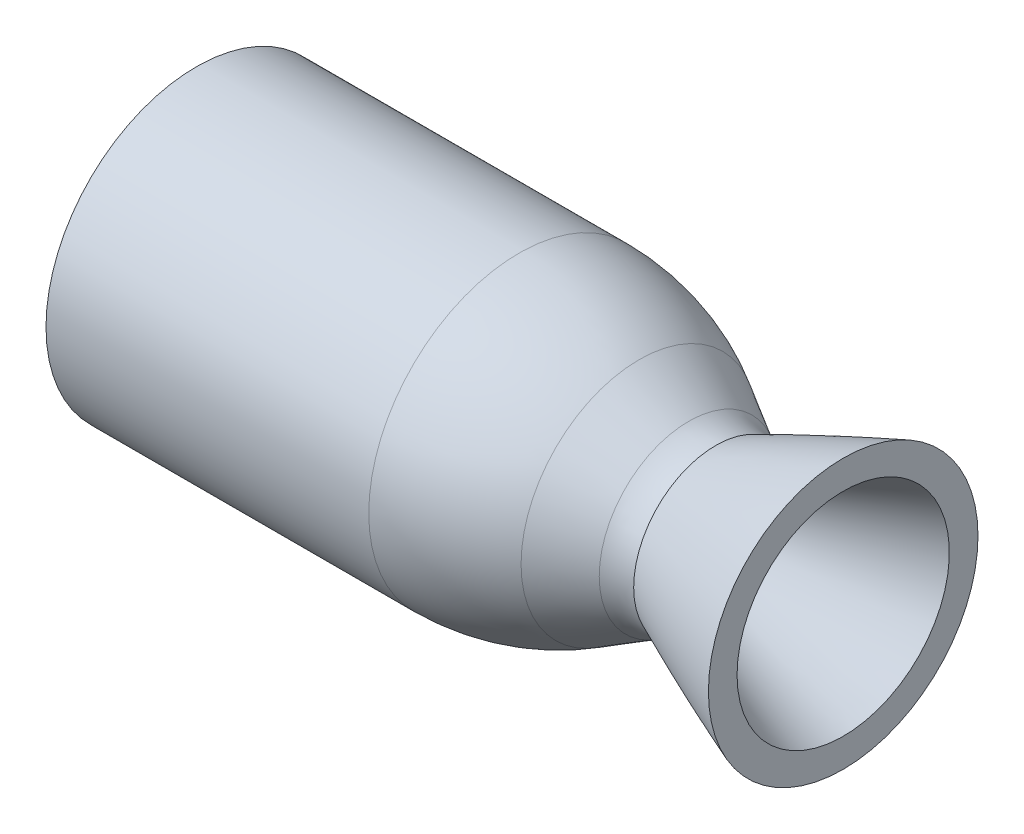
ISO-10303-21;
HEADER;
FILE_DESCRIPTION(('STEP AP214'),'2;1');
FILE_NAME('part.step','',(''),(''),'','','');
FILE_SCHEMA(('AUTOMOTIVE_DESIGN { 1 0 10303 214 1 1 1 1 }'));
ENDSEC;
DATA;
#1=APPLICATION_CONTEXT('core data for automotive mechanical design processes');
#2=APPLICATION_PROTOCOL_DEFINITION('international standard','automotive_design',2000,#1);
#3=PRODUCT_CONTEXT('',#1,'mechanical');
#4=PRODUCT('Part','Part','',(#3));
#5=PRODUCT_RELATED_PRODUCT_CATEGORY('part','',(#4));
#6=PRODUCT_DEFINITION_FORMATION('','',#4);
#7=PRODUCT_DEFINITION_CONTEXT('part definition',#1,'design');
#8=PRODUCT_DEFINITION('design','',#6,#7);
#9=PRODUCT_DEFINITION_SHAPE('','',#8);
#10=(LENGTH_UNIT() NAMED_UNIT(*) SI_UNIT(.MILLI.,.METRE.));
#11=(NAMED_UNIT(*) PLANE_ANGLE_UNIT() SI_UNIT($,.RADIAN.));
#12=(NAMED_UNIT(*) SI_UNIT($,.STERADIAN.) SOLID_ANGLE_UNIT());
#13=UNCERTAINTY_MEASURE_WITH_UNIT(LENGTH_MEASURE(1.E-05),#10,'distance_accuracy_value','');
#14=(GEOMETRIC_REPRESENTATION_CONTEXT(3) GLOBAL_UNCERTAINTY_ASSIGNED_CONTEXT((#13)) GLOBAL_UNIT_ASSIGNED_CONTEXT((#10,
#11,#12)) REPRESENTATION_CONTEXT('',''));
#15=CARTESIAN_POINT('',(0.,0.,0.));
#16=DIRECTION('',(0.,0.,1.));
#17=DIRECTION('',(1.,0.,0.));
#18=AXIS2_PLACEMENT_3D('',#15,#16,#17);
#19=CARTESIAN_POINT('',(-328554.941097475,-944702.612831236,0.));
#20=CARTESIAN_POINT('',(299052.618948012,954550.543522296,0.));
#21=CARTESIAN_POINT('',(-266586.441738546,-964070.381613968,0.));
#22=B_SPLINE_CURVE_WITH_KNOTS('',2,(#19,#20,#21),.UNSPECIFIED.,.F.,.F.,(3,3),(0.,1.),.UNSPECIFIED.);
#23=CARTESIAN_POINT('',(0.,0.,0.));
#24=DIRECTION('',(-1.,0.,0.));
#25=AXIS1_PLACEMENT('',#23,#24);
#26=SURFACE_OF_REVOLUTION('',#22,#25);
#27=CARTESIAN_POINT('',(290.485999999982,0.,0.));
#28=DIRECTION('',(-1.,0.,0.));
#29=DIRECTION('',(0.,0.,1.));
#30=AXIS2_PLACEMENT_3D('',#27,#28,#29);
#31=CIRCLE('',#30,47.6714949946149);
#32=CARTESIAN_POINT('',(290.485999999982,0.,47.6714949946149));
#33=VERTEX_POINT('',#32);
#34=EDGE_CURVE('E89',#33,#33,#31,.F.);
#35=ORIENTED_EDGE('',*,*,#34,.T.);
#36=EDGE_LOOP('',(#35));
#37=FACE_BOUND('',#36,.T.);
#38=CARTESIAN_POINT('',(237.597587303106,0.,0.));
#39=DIRECTION('',(-1.,0.,0.));
#40=DIRECTION('',(0.,0.,1.));
#41=AXIS2_PLACEMENT_3D('',#38,#39,#40);
#42=CIRCLE('',#41,25.6397929663954);
#43=CARTESIAN_POINT('',(237.597587303106,0.,25.6397929663954));
#44=VERTEX_POINT('',#43);
#45=EDGE_CURVE('E85',#44,#44,#42,.T.);
#46=ORIENTED_EDGE('',*,*,#45,.T.);
#47=EDGE_LOOP('',(#46));
#48=FACE_BOUND('',#47,.T.);
#49=ADVANCED_FACE('F37',(#37,#48),#26,.T.);
#50=CARTESIAN_POINT('',(367.057221516335,86.4715203187351,0.));
#51=CARTESIAN_POINT('',(364.330437681281,85.6713080678098,0.));
#52=CARTESIAN_POINT('',(358.895885037322,84.0493978378864,0.));
#53=CARTESIAN_POINT('',(347.963085647871,80.6786723934971,0.));
#54=CARTESIAN_POINT('',(334.241993713204,76.2462937852929,0.));
#55=CARTESIAN_POINT('',(317.668219235593,70.5714099812685,0.));
#56=CARTESIAN_POINT('',(300.99141000092,64.5423883209961,0.));
#57=CARTESIAN_POINT('',(284.209562023748,58.1588420495625,0.));
#58=CARTESIAN_POINT('',(267.324585602691,51.4218351331522,0.));
#59=CARTESIAN_POINT('',(253.162518772892,45.5109821884707,0.));
#60=CARTESIAN_POINT('',(241.789514516529,40.609481324773,0.));
#61=CARTESIAN_POINT('',(236.069082048717,38.092486570406,0.));
#62=CARTESIAN_POINT('',(233.22019623013,36.826239285025,0.));
#63=B_SPLINE_CURVE_WITH_KNOTS('',3,(#50,#51,#52,#53,#54,#55,#56,#57,#58,#59,#60,#61,#62),
.UNSPECIFIED.,.F.,.F.,(4,1,1,1,1,1,1,1,1,1,4),(0.492865274025512,0.492972774083959,
0.493080274142406,0.493295274259301,0.493510274376196,0.493725274493091,0.493940274609985,
0.49415527472688,0.494370274843775,0.494477774902222,0.494585274960669),.UNSPECIFIED.);
#64=CARTESIAN_POINT('',(0.,0.,0.));
#65=DIRECTION('',(-1.,0.,0.));
#66=AXIS1_PLACEMENT('',#64,#65);
#67=SURFACE_OF_REVOLUTION('',#63,#66);
#68=CARTESIAN_POINT('',(290.485999999995,0.,0.));
#69=DIRECTION('',(-1.,0.,0.));
#70=DIRECTION('',(0.,0.,1.));
#71=AXIS2_PLACEMENT_3D('',#68,#69,#70);
#72=CIRCLE('',#71,60.5307203759711);
#73=CARTESIAN_POINT('',(290.485999999995,0.,60.5307203759711));
#74=VERTEX_POINT('',#73);
#75=EDGE_CURVE('E41',#74,#74,#72,.T.);
#76=ORIENTED_EDGE('',*,*,#75,.T.);
#77=EDGE_LOOP('',(#76));
#78=FACE_BOUND('',#77,.T.);
#79=CARTESIAN_POINT('',(233.220196230122,0.,0.));
#80=DIRECTION('',(-1.,0.,0.));
#81=DIRECTION('',(0.,0.,1.));
#82=AXIS2_PLACEMENT_3D('',#79,#80,#81);
#83=CIRCLE('',#82,36.8262392850206);
#84=CARTESIAN_POINT('',(233.220196230122,0.,36.8262392850206));
#85=VERTEX_POINT('',#84);
#86=EDGE_CURVE('E10',#85,#85,#83,.T.);
#87=ORIENTED_EDGE('',*,*,#86,.F.);
#88=EDGE_LOOP('',(#87));
#89=FACE_BOUND('',#88,.T.);
#90=ADVANCED_FACE('F100',(#78,#89),#67,.T.);
#91=CARTESIAN_POINT('',(233.742807352704,0.,0.));
#92=DIRECTION('',(-1.,0.,0.));
#93=DIRECTION('',(0.,0.,1.));
#94=AXIS2_PLACEMENT_3D('',#91,#92,#93);
#95=TOROIDAL_SURFACE('',#94,62.0521463362453,25.2313200000015);
#96=CARTESIAN_POINT('',(221.127153584912,0.,0.));
#97=DIRECTION('',(-1.,0.,0.));
#98=DIRECTION('',(0.,0.,1.));
#99=AXIS2_PLACEMENT_3D('',#96,#97,#98);
#100=CIRCLE('',#99,40.2011786470614);
#101=CARTESIAN_POINT('',(221.127153584912,0.,40.2011786470614));
#102=VERTEX_POINT('',#101);
#103=EDGE_CURVE('E46',#102,#102,#100,.T.);
#104=ORIENTED_EDGE('',*,*,#103,.F.);
#105=EDGE_LOOP('',(#104));
#106=FACE_BOUND('',#105,.T.);
#107=ORIENTED_EDGE('',*,*,#86,.T.);
#108=EDGE_LOOP('',(#107));
#109=FACE_BOUND('',#108,.T.);
#110=ADVANCED_FACE('F103',(#106,#109),#95,.F.);
#111=CARTESIAN_POINT('',(221.127153584912,0.,0.));
#112=DIRECTION('',(-1.,0.,0.));
#113=DIRECTION('',(0.,0.,1.));
#114=AXIS2_PLACEMENT_3D('',#111,#112,#113);
#115=CONICAL_SURFACE('',#114,40.2011786470614,0.523599596469802);
#116=CARTESIAN_POINT('',(198.877039879445,0.,0.));
#117=DIRECTION('',(-1.,0.,0.));
#118=DIRECTION('',(0.,0.,1.));
#119=AXIS2_PLACEMENT_3D('',#116,#117,#118);
#120=CIRCLE('',#119,53.0473121370699);
#121=CARTESIAN_POINT('',(198.877039879445,0.,53.0473121370699));
#122=VERTEX_POINT('',#121);
#123=EDGE_CURVE('E51',#122,#122,#120,.T.);
#124=ORIENTED_EDGE('',*,*,#123,.F.);
#125=EDGE_LOOP('',(#124));
#126=FACE_BOUND('',#125,.T.);
#127=ORIENTED_EDGE('',*,*,#103,.T.);
#128=EDGE_LOOP('',(#127));
#129=FACE_BOUND('',#128,.T.);
#130=ADVANCED_FACE('F107',(#126,#129),#115,.T.);
#131=CARTESIAN_POINT('',(144.934590184679,0.,0.));
#132=DIRECTION('',(-1.,0.,0.));
#133=DIRECTION('',(0.,0.,1.));
#134=AXIS2_PLACEMENT_3D('',#131,#132,#133);
#135=DEGENERATE_TOROIDAL_SURFACE('',#134,40.3835742999741,107.884745999999,.F.);
#136=CARTESIAN_POINT('',(144.934660600002,0.,0.));
#137=DIRECTION('',(-1.,0.,0.));
#138=DIRECTION('',(0.,0.,1.));
#139=AXIS2_PLACEMENT_3D('',#136,#137,#138);
#140=CIRCLE('',#139,67.5011717);
#141=CARTESIAN_POINT('',(144.934660600002,0.,67.5011717));
#142=VERTEX_POINT('',#141);
#143=EDGE_CURVE('E57',#142,#142,#140,.T.);
#144=ORIENTED_EDGE('',*,*,#143,.F.);
#145=EDGE_LOOP('',(#144));
#146=FACE_BOUND('',#145,.T.);
#147=ORIENTED_EDGE('',*,*,#123,.T.);
#148=EDGE_LOOP('',(#147));
#149=FACE_BOUND('',#148,.T.);
#150=ADVANCED_FACE('F111',(#146,#149),#135,.F.);
#151=CARTESIAN_POINT('',(0.,0.,0.));
#152=DIRECTION('',(-1.,0.,0.));
#153=DIRECTION('',(0.,0.,1.));
#154=AXIS2_PLACEMENT_3D('',#151,#152,#153);
#155=CYLINDRICAL_SURFACE('',#154,67.5011717);
#156=CARTESIAN_POINT('',(0.,0.,0.));
#157=DIRECTION('',(-1.,0.,0.));
#158=DIRECTION('',(0.,0.,1.));
#159=AXIS2_PLACEMENT_3D('',#156,#157,#158);
#160=CIRCLE('',#159,67.5011717);
#161=CARTESIAN_POINT('',(0.,0.,67.5011717));
#162=VERTEX_POINT('',#161);
#163=EDGE_CURVE('E61',#162,#162,#160,.T.);
#164=ORIENTED_EDGE('',*,*,#163,.F.);
#165=EDGE_LOOP('',(#164));
#166=FACE_BOUND('',#165,.T.);
#167=ORIENTED_EDGE('',*,*,#143,.T.);
#168=EDGE_LOOP('',(#167));
#169=FACE_BOUND('',#168,.T.);
#170=ADVANCED_FACE('F115',(#166,#169),#155,.T.);
#171=CARTESIAN_POINT('',(0.,67.5011717,0.));
#172=DIRECTION('',(1.,0.,0.));
#173=DIRECTION('',(0.,0.,-1.));
#174=AXIS2_PLACEMENT_3D('',#171,#172,#173);
#175=PLANE('',#174);
#176=CARTESIAN_POINT('',(0.,0.,0.));
#177=DIRECTION('',(-1.,0.,0.));
#178=DIRECTION('',(0.,0.,1.));
#179=AXIS2_PLACEMENT_3D('',#176,#177,#178);
#180=CIRCLE('',#179,55.5011717);
#181=CARTESIAN_POINT('',(0.,0.,55.5011717));
#182=VERTEX_POINT('',#181);
#183=EDGE_CURVE('E65',#182,#182,#180,.T.);
#184=ORIENTED_EDGE('',*,*,#183,.F.);
#185=EDGE_LOOP('',(#184));
#186=FACE_BOUND('',#185,.T.);
#187=ORIENTED_EDGE('',*,*,#163,.T.);
#188=EDGE_LOOP('',(#187));
#189=FACE_BOUND('',#188,.T.);
#190=ADVANCED_FACE('F119',(#186,#189),#175,.F.);
#191=CARTESIAN_POINT('',(0.,0.,0.));
#192=DIRECTION('',(-1.,0.,0.));
#193=DIRECTION('',(0.,0.,1.));
#194=AXIS2_PLACEMENT_3D('',#191,#192,#193);
#195=CYLINDRICAL_SURFACE('',#194,55.5011717);
#196=CARTESIAN_POINT('',(144.934660600002,0.,0.));
#197=DIRECTION('',(-1.,0.,0.));
#198=DIRECTION('',(0.,0.,1.));
#199=AXIS2_PLACEMENT_3D('',#196,#197,#198);
#200=CIRCLE('',#199,55.5011717);
#201=CARTESIAN_POINT('',(144.934660600002,0.,55.5011717));
#202=VERTEX_POINT('',#201);
#203=EDGE_CURVE('E69',#202,#202,#200,.T.);
#204=ORIENTED_EDGE('',*,*,#203,.F.);
#205=EDGE_LOOP('',(#204));
#206=FACE_BOUND('',#205,.T.);
#207=ORIENTED_EDGE('',*,*,#183,.T.);
#208=EDGE_LOOP('',(#207));
#209=FACE_BOUND('',#208,.T.);
#210=ADVANCED_FACE('F123',(#206,#209),#195,.F.);
#211=CARTESIAN_POINT('',(144.934590184679,0.,0.));
#212=DIRECTION('',(-1.,0.,0.));
#213=DIRECTION('',(0.,0.,1.));
#214=AXIS2_PLACEMENT_3D('',#211,#212,#213);
#215=DEGENERATE_TOROIDAL_SURFACE('',#214,40.3835742999741,95.884746,.F.);
#216=CARTESIAN_POINT('',(192.877031348701,0.,0.));
#217=DIRECTION('',(-1.,0.,0.));
#218=DIRECTION('',(0.,0.,1.));
#219=AXIS2_PLACEMENT_3D('',#216,#217,#218);
#220=CIRCLE('',#219,42.6550122168902);
#221=CARTESIAN_POINT('',(192.877031348701,0.,42.6550122168902));
#222=VERTEX_POINT('',#221);
#223=EDGE_CURVE('E73',#222,#222,#220,.T.);
#224=ORIENTED_EDGE('',*,*,#223,.F.);
#225=EDGE_LOOP('',(#224));
#226=FACE_BOUND('',#225,.T.);
#227=ORIENTED_EDGE('',*,*,#203,.T.);
#228=EDGE_LOOP('',(#227));
#229=FACE_BOUND('',#228,.T.);
#230=ADVANCED_FACE('F127',(#226,#229),#215,.T.);
#231=CARTESIAN_POINT('',(192.877031348701,0.,0.));
#232=DIRECTION('',(-1.,0.,0.));
#233=DIRECTION('',(0.,0.,1.));
#234=AXIS2_PLACEMENT_3D('',#231,#232,#233);
#235=CONICAL_SURFACE('',#234,42.6550122168902,0.523599596469766);
#236=CARTESIAN_POINT('',(215.127149697398,0.,0.));
#237=DIRECTION('',(-1.,0.,0.));
#238=DIRECTION('',(0.,0.,1.));
#239=AXIS2_PLACEMENT_3D('',#236,#237,#238);
#240=CIRCLE('',#239,29.8088760461076);
#241=CARTESIAN_POINT('',(215.127149697398,0.,29.8088760461076));
#242=VERTEX_POINT('',#241);
#243=EDGE_CURVE('E77',#242,#242,#240,.T.);
#244=ORIENTED_EDGE('',*,*,#243,.F.);
#245=EDGE_LOOP('',(#244));
#246=FACE_BOUND('',#245,.T.);
#247=ORIENTED_EDGE('',*,*,#223,.T.);
#248=EDGE_LOOP('',(#247));
#249=FACE_BOUND('',#248,.T.);
#250=ADVANCED_FACE('F131',(#246,#249),#235,.F.);
#251=CARTESIAN_POINT('',(233.742807352704,0.,0.));
#252=DIRECTION('',(-1.,0.,0.));
#253=DIRECTION('',(0.,0.,1.));
#254=AXIS2_PLACEMENT_3D('',#251,#252,#253);
#255=TOROIDAL_SURFACE('',#254,62.0521463362453,37.23132);
#256=CARTESIAN_POINT('',(233.742783423231,0.,0.));
#257=DIRECTION('',(-1.,0.,0.));
#258=DIRECTION('',(0.,0.,1.));
#259=AXIS2_PLACEMENT_3D('',#256,#257,#258);
#260=CIRCLE('',#259,24.820826336253);
#261=CARTESIAN_POINT('',(233.742783423231,0.,24.820826336253));
#262=VERTEX_POINT('',#261);
#263=EDGE_CURVE('E81',#262,#262,#260,.T.);
#264=ORIENTED_EDGE('',*,*,#263,.F.);
#265=EDGE_LOOP('',(#264));
#266=FACE_BOUND('',#265,.T.);
#267=ORIENTED_EDGE('',*,*,#243,.T.);
#268=EDGE_LOOP('',(#267));
#269=FACE_BOUND('',#268,.T.);
#270=ADVANCED_FACE('F135',(#266,#269),#255,.T.);
#271=CARTESIAN_POINT('',(233.742789517264,0.,0.));
#272=DIRECTION('',(-1.,0.,0.));
#273=DIRECTION('',(0.,0.,1.));
#274=AXIS2_PLACEMENT_3D('',#271,#272,#273);
#275=TOROIDAL_SURFACE('',#274,34.302392336251,9.481566);
#276=ORIENTED_EDGE('',*,*,#45,.F.);
#277=EDGE_LOOP('',(#276));
#278=FACE_BOUND('',#277,.T.);
#279=ORIENTED_EDGE('',*,*,#263,.T.);
#280=EDGE_LOOP('',(#279));
#281=FACE_BOUND('',#280,.T.);
#282=ADVANCED_FACE('F139',(#278,#281),#275,.T.);
#283=CARTESIAN_POINT('',(290.485999999996,149.344558601771,-87.4631536471239));
#284=DIRECTION('',(-1.,0.,0.));
#285=DIRECTION('',(0.,-1.,0.));
#286=AXIS2_PLACEMENT_3D('',#283,#284,#285);
#287=PLANE('',#286);
#288=ORIENTED_EDGE('',*,*,#75,.F.);
#289=EDGE_LOOP('',(#288));
#290=FACE_BOUND('',#289,.T.);
#291=ORIENTED_EDGE('',*,*,#34,.F.);
#292=EDGE_LOOP('',(#291));
#293=FACE_BOUND('',#292,.T.);
#294=ADVANCED_FACE('F143',(#290,#293),#287,.F.);
#295=CLOSED_SHELL('',(#49,#90,#110,#130,#150,#170,#190,#210,#230,#250,#270,#282,#294));
#296=MANIFOLD_SOLID_BREP('B2',#295);
#297=ADVANCED_BREP_SHAPE_REPRESENTATION('',(#18,#296),#14);
#298=SHAPE_DEFINITION_REPRESENTATION(#9,#297);
ENDSEC;
END-ISO-10303-21;
